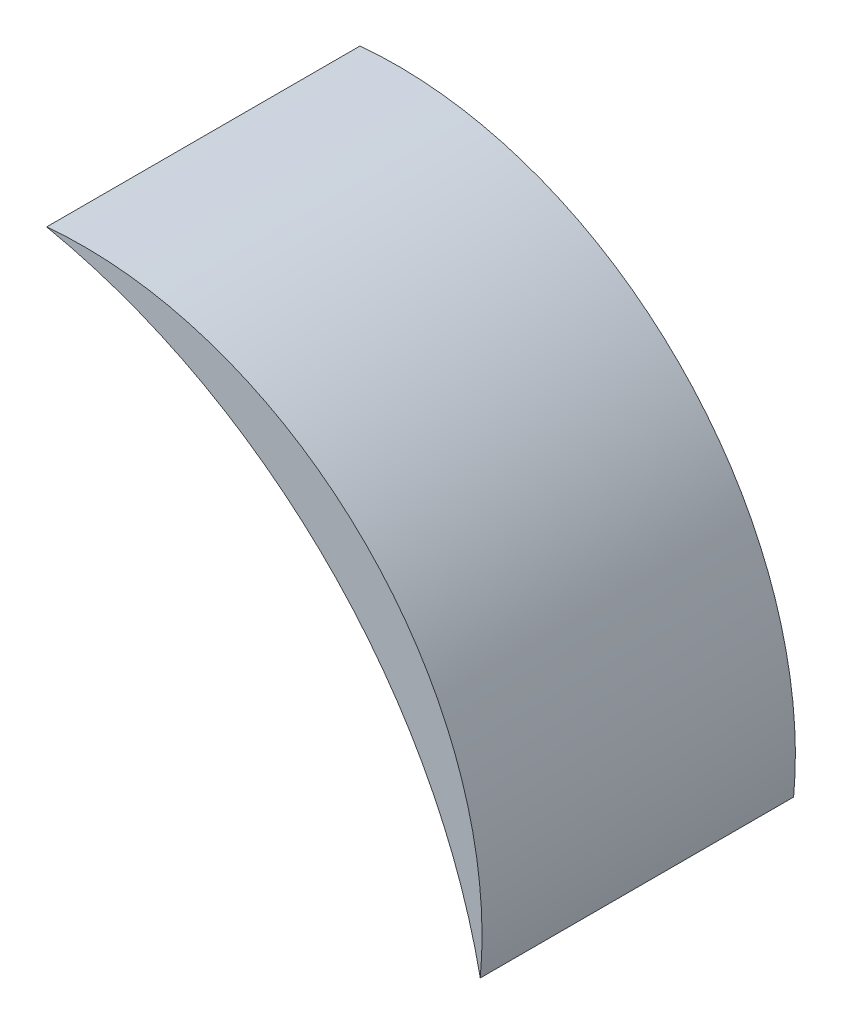
ISO-10303-21;
HEADER;
FILE_DESCRIPTION(('STEP AP214'),'2;1');
FILE_NAME('part.step','',(''),(''),'','','');
FILE_SCHEMA(('AUTOMOTIVE_DESIGN { 1 0 10303 214 1 1 1 1 }'));
ENDSEC;
DATA;
#1=APPLICATION_CONTEXT('core data for automotive mechanical design processes');
#2=APPLICATION_PROTOCOL_DEFINITION('international standard','automotive_design',2000,#1);
#3=PRODUCT_CONTEXT('',#1,'mechanical');
#4=PRODUCT('Part','Part','',(#3));
#5=PRODUCT_RELATED_PRODUCT_CATEGORY('part','',(#4));
#6=PRODUCT_DEFINITION_FORMATION('','',#4);
#7=PRODUCT_DEFINITION_CONTEXT('part definition',#1,'design');
#8=PRODUCT_DEFINITION('design','',#6,#7);
#9=PRODUCT_DEFINITION_SHAPE('','',#8);
#10=(LENGTH_UNIT() NAMED_UNIT(*) SI_UNIT(.MILLI.,.METRE.));
#11=(NAMED_UNIT(*) PLANE_ANGLE_UNIT() SI_UNIT($,.RADIAN.));
#12=(NAMED_UNIT(*) SI_UNIT($,.STERADIAN.) SOLID_ANGLE_UNIT());
#13=UNCERTAINTY_MEASURE_WITH_UNIT(LENGTH_MEASURE(1.E-05),#10,'distance_accuracy_value','');
#14=(GEOMETRIC_REPRESENTATION_CONTEXT(3) GLOBAL_UNCERTAINTY_ASSIGNED_CONTEXT((#13)) GLOBAL_UNIT_ASSIGNED_CONTEXT((#10,
#11,#12)) REPRESENTATION_CONTEXT('',''));
#15=CARTESIAN_POINT('',(0.,0.,0.));
#16=DIRECTION('',(0.,0.,1.));
#17=DIRECTION('',(1.,0.,0.));
#18=AXIS2_PLACEMENT_3D('',#15,#16,#17);
#19=CARTESIAN_POINT('',(138.2714532,93.5674532,0.));
#20=DIRECTION('',(0.,0.,-1.));
#21=DIRECTION('',(0.707106781186604,-0.707106781186492,0.));
#22=AXIS2_PLACEMENT_3D('',#19,#20,#21);
#23=CYLINDRICAL_SURFACE('',#22,0.254001156230771);
#24=CARTESIAN_POINT('',(138.2714532,93.5674532,0.1999996));
#25=DIRECTION('',(0.,0.,1.));
#26=DIRECTION('',(0.707106781186604,-0.707106781186492,0.));
#27=AXIS2_PLACEMENT_3D('',#24,#25,#26);
#28=CIRCLE('',#27,0.254001156230771);
#29=CARTESIAN_POINT('',(138.524327205897,93.5435508045516,0.1999996));
#30=VERTEX_POINT('',#29);
#31=CARTESIAN_POINT('',(138.247550804552,93.820327205897,0.1999996));
#32=VERTEX_POINT('',#31);
#33=EDGE_CURVE('E11',#30,#32,#28,.T.);
#34=ORIENTED_EDGE('',*,*,#33,.F.);
#35=DIRECTION('',(0.,0.,1.));
#36=VECTOR('',#35,1.);
#37=CARTESIAN_POINT('',(138.524327205897,93.5435508045516,0.));
#38=LINE('',#37,#36);
#39=CARTESIAN_POINT('',(138.524327205897,93.5435508045516,0.));
#40=VERTEX_POINT('',#39);
#41=EDGE_CURVE('E24',#40,#30,#38,.T.);
#42=ORIENTED_EDGE('',*,*,#41,.F.);
#43=CARTESIAN_POINT('',(138.2714532,93.5674532,0.));
#44=DIRECTION('',(0.,0.,1.));
#45=DIRECTION('',(0.707106781186604,-0.707106781186492,0.));
#46=AXIS2_PLACEMENT_3D('',#43,#44,#45);
#47=CIRCLE('',#46,0.254001156230771);
#48=CARTESIAN_POINT('',(138.247550804552,93.820327205897,0.));
#49=VERTEX_POINT('',#48);
#50=EDGE_CURVE('E46',#40,#49,#47,.T.);
#51=ORIENTED_EDGE('',*,*,#50,.T.);
#52=DIRECTION('',(0.,0.,1.));
#53=VECTOR('',#52,1.);
#54=CARTESIAN_POINT('',(138.247550804552,93.820327205897,0.));
#55=LINE('',#54,#53);
#56=EDGE_CURVE('E37',#49,#32,#55,.T.);
#57=ORIENTED_EDGE('',*,*,#56,.T.);
#58=EDGE_LOOP('',(#34,#42,#51,#57));
#59=FACE_BOUND('',#58,.T.);
#60=ADVANCED_FACE('F17',(#59),#23,.T.);
#61=CARTESIAN_POINT('',(138.176,93.472,0.));
#62=DIRECTION('',(0.,0.,-1.));
#63=DIRECTION('',(1.,0.,0.));
#64=AXIS2_PLACEMENT_3D('',#61,#62,#63);
#65=CYLINDRICAL_SURFACE('',#64,0.3556);
#66=ORIENTED_EDGE('',*,*,#41,.T.);
#67=CARTESIAN_POINT('',(138.176,93.472,0.1999996));
#68=DIRECTION('',(0.,0.,1.));
#69=DIRECTION('',(1.,0.,0.));
#70=AXIS2_PLACEMENT_3D('',#67,#68,#69);
#71=CIRCLE('',#70,0.3556);
#72=EDGE_CURVE('E45',#30,#32,#71,.T.);
#73=ORIENTED_EDGE('',*,*,#72,.T.);
#74=ORIENTED_EDGE('',*,*,#56,.F.);
#75=CARTESIAN_POINT('',(138.176,93.472,0.));
#76=DIRECTION('',(0.,0.,1.));
#77=DIRECTION('',(1.,0.,0.));
#78=AXIS2_PLACEMENT_3D('',#75,#76,#77);
#79=CIRCLE('',#78,0.3556);
#80=EDGE_CURVE('E43',#40,#49,#79,.T.);
#81=ORIENTED_EDGE('',*,*,#80,.F.);
#82=EDGE_LOOP('',(#66,#73,#74,#81));
#83=FACE_BOUND('',#82,.T.);
#84=ADVANCED_FACE('F41',(#83),#65,.F.);
#85=CARTESIAN_POINT('',(138.35560594,93.29239406,0.));
#86=DIRECTION('',(0.,0.,-1.));
#87=DIRECTION('',(-1.,0.,0.));
#88=AXIS2_PLACEMENT_3D('',#85,#86,#87);
#89=PLANE('',#88);
#90=ORIENTED_EDGE('',*,*,#50,.F.);
#91=ORIENTED_EDGE('',*,*,#80,.T.);
#92=EDGE_LOOP('',(#90,#91));
#93=FACE_BOUND('',#92,.T.);
#94=ADVANCED_FACE('F51',(#93),#89,.T.);
#95=CARTESIAN_POINT('',(138.35560594,93.29239406,0.1999996));
#96=DIRECTION('',(0.,0.,-1.));
#97=DIRECTION('',(-1.,0.,0.));
#98=AXIS2_PLACEMENT_3D('',#95,#96,#97);
#99=PLANE('',#98);
#100=ORIENTED_EDGE('',*,*,#72,.F.);
#101=ORIENTED_EDGE('',*,*,#33,.T.);
#102=EDGE_LOOP('',(#100,#101));
#103=FACE_BOUND('',#102,.T.);
#104=ADVANCED_FACE('F55',(#103),#99,.F.);
#105=CLOSED_SHELL('',(#60,#84,#94,#104));
#106=MANIFOLD_SOLID_BREP('B1',#105);
#107=ADVANCED_BREP_SHAPE_REPRESENTATION('',(#18,#106),#14);
#108=SHAPE_DEFINITION_REPRESENTATION(#9,#107);
ENDSEC;
END-ISO-10303-21;
